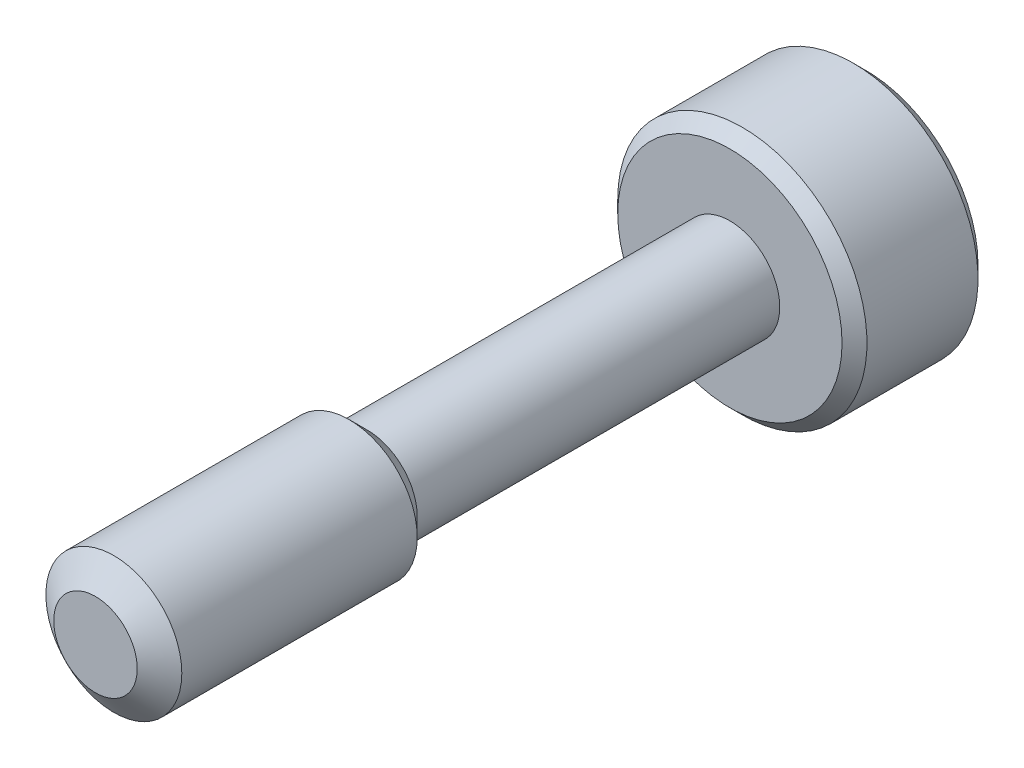
ISO-10303-21;
HEADER;
FILE_DESCRIPTION(('STEP AP214'),'2;1');
FILE_NAME('part.step','',(''),(''),'','','');
FILE_SCHEMA(('AUTOMOTIVE_DESIGN { 1 0 10303 214 1 1 1 1 }'));
ENDSEC;
DATA;
#1=APPLICATION_CONTEXT('core data for automotive mechanical design processes');
#2=APPLICATION_PROTOCOL_DEFINITION('international standard','automotive_design',2000,#1);
#3=PRODUCT_CONTEXT('',#1,'mechanical');
#4=PRODUCT('Part','Part','',(#3));
#5=PRODUCT_RELATED_PRODUCT_CATEGORY('part','',(#4));
#6=PRODUCT_DEFINITION_FORMATION('','',#4);
#7=PRODUCT_DEFINITION_CONTEXT('part definition',#1,'design');
#8=PRODUCT_DEFINITION('design','',#6,#7);
#9=PRODUCT_DEFINITION_SHAPE('','',#8);
#10=(LENGTH_UNIT() NAMED_UNIT(*) SI_UNIT(.MILLI.,.METRE.));
#11=(NAMED_UNIT(*) PLANE_ANGLE_UNIT() SI_UNIT($,.RADIAN.));
#12=(NAMED_UNIT(*) SI_UNIT($,.STERADIAN.) SOLID_ANGLE_UNIT());
#13=UNCERTAINTY_MEASURE_WITH_UNIT(LENGTH_MEASURE(1.E-05),#10,'distance_accuracy_value','');
#14=(GEOMETRIC_REPRESENTATION_CONTEXT(3) GLOBAL_UNCERTAINTY_ASSIGNED_CONTEXT((#13)) GLOBAL_UNIT_ASSIGNED_CONTEXT((#10,
#11,#12)) REPRESENTATION_CONTEXT('',''));
#15=CARTESIAN_POINT('',(0.,0.,0.));
#16=DIRECTION('',(0.,0.,1.));
#17=DIRECTION('',(1.,0.,0.));
#18=AXIS2_PLACEMENT_3D('',#15,#16,#17);
#19=CARTESIAN_POINT('',(0.,0.,-17.0000000000001));
#20=DIRECTION('',(0.,0.,1.));
#21=DIRECTION('',(1.,0.,0.));
#22=AXIS2_PLACEMENT_3D('',#19,#20,#21);
#23=CYLINDRICAL_SURFACE('',#22,2.75);
#24=CARTESIAN_POINT('',(0.,0.,-16.7250000000001));
#25=DIRECTION('',(0.,0.,-1.));
#26=DIRECTION('',(-1.,0.,0.));
#27=AXIS2_PLACEMENT_3D('',#24,#25,#26);
#28=CIRCLE('',#27,2.75);
#29=CARTESIAN_POINT('',(-2.75000000000008,0.,-16.7250000000001));
#30=VERTEX_POINT('',#29);
#31=EDGE_CURVE('E45',#30,#30,#28,.F.);
#32=ORIENTED_EDGE('',*,*,#31,.T.);
#33=EDGE_LOOP('',(#32));
#34=FACE_BOUND('',#33,.T.);
#35=CARTESIAN_POINT('',(0.,0.,-14.2750000000001));
#36=DIRECTION('',(0.,0.,-1.));
#37=DIRECTION('',(-1.,0.,0.));
#38=AXIS2_PLACEMENT_3D('',#35,#36,#37);
#39=CIRCLE('',#38,2.75);
#40=CARTESIAN_POINT('',(-2.75000000000001,0.,-14.2750000000001));
#41=VERTEX_POINT('',#40);
#42=EDGE_CURVE('E176',#41,#41,#39,.T.);
#43=ORIENTED_EDGE('',*,*,#42,.T.);
#44=EDGE_LOOP('',(#43));
#45=FACE_BOUND('',#44,.T.);
#46=ADVANCED_FACE('F37',(#34,#45),#23,.T.);
#47=CARTESIAN_POINT('',(0.,0.,-17.0000000000001));
#48=DIRECTION('',(0.,0.,-1.));
#49=DIRECTION('',(-1.,0.,0.));
#50=AXIS2_PLACEMENT_3D('',#47,#48,#49);
#51=PLANE('',#50);
#52=CARTESIAN_POINT('',(0.,0.,-17.0000000000001));
#53=DIRECTION('',(0.,0.,-1.));
#54=DIRECTION('',(-1.,0.,0.));
#55=AXIS2_PLACEMENT_3D('',#52,#53,#54);
#56=CIRCLE('',#55,2.47499999999999);
#57=CARTESIAN_POINT('',(-2.47500000000002,0.,-17.0000000000001));
#58=VERTEX_POINT('',#57);
#59=EDGE_CURVE('E110',#58,#58,#56,.T.);
#60=ORIENTED_EDGE('',*,*,#59,.T.);
#61=EDGE_LOOP('',(#60));
#62=FACE_BOUND('',#61,.T.);
#63=CARTESIAN_POINT('',(0.,0.,-17.0000000000001));
#64=DIRECTION('',(0.,0.,-1.));
#65=DIRECTION('',(-1.,0.,0.));
#66=AXIS2_PLACEMENT_3D('',#63,#64,#65);
#67=CIRCLE('',#66,1.44337567297407);
#68=CARTESIAN_POINT('',(-1.25,0.721687836487031,-17.0000000000001));
#69=VERTEX_POINT('',#68);
#70=CARTESIAN_POINT('',(0.,1.44337567297406,-17.0000000000001));
#71=VERTEX_POINT('',#70);
#72=EDGE_CURVE('E91',#69,#71,#67,.T.);
#73=ORIENTED_EDGE('',*,*,#72,.F.);
#74=CARTESIAN_POINT('',(-1.25000000000004,-0.721687836487041,-17.0000000000001));
#75=VERTEX_POINT('',#74);
#76=EDGE_CURVE('E51',#75,#69,#67,.T.);
#77=ORIENTED_EDGE('',*,*,#76,.F.);
#78=CARTESIAN_POINT('',(0.,-1.44337567297407,-17.0000000000001));
#79=VERTEX_POINT('',#78);
#80=EDGE_CURVE('E230',#79,#75,#67,.T.);
#81=ORIENTED_EDGE('',*,*,#80,.F.);
#82=CARTESIAN_POINT('',(1.25,-0.721687836487038,-17.0000000000001));
#83=VERTEX_POINT('',#82);
#84=EDGE_CURVE('E58',#83,#79,#67,.T.);
#85=ORIENTED_EDGE('',*,*,#84,.F.);
#86=CARTESIAN_POINT('',(1.24999999999997,0.721687836487043,-17.0000000000001));
#87=VERTEX_POINT('',#86);
#88=EDGE_CURVE('E131',#87,#83,#67,.T.);
#89=ORIENTED_EDGE('',*,*,#88,.F.);
#90=EDGE_CURVE('E100',#71,#87,#67,.T.);
#91=ORIENTED_EDGE('',*,*,#90,.F.);
#92=EDGE_LOOP('',(#73,#77,#81,#85,#89,#91));
#93=FACE_BOUND('',#92,.T.);
#94=ADVANCED_FACE('F130',(#62,#93),#51,.T.);
#95=CARTESIAN_POINT('',(0.,0.,-14.0000000000001));
#96=DIRECTION('',(0.,0.,-1.));
#97=DIRECTION('',(-1.,0.,0.));
#98=AXIS2_PLACEMENT_3D('',#95,#96,#97);
#99=PLANE('',#98);
#100=CARTESIAN_POINT('',(0.,0.,-14.0000000000001));
#101=DIRECTION('',(0.,0.,-1.));
#102=DIRECTION('',(-1.,0.,0.));
#103=AXIS2_PLACEMENT_3D('',#100,#101,#102);
#104=CIRCLE('',#103,2.47499999999999);
#105=CARTESIAN_POINT('',(-2.47500000000004,0.,-14.0000000000001));
#106=VERTEX_POINT('',#105);
#107=EDGE_CURVE('E12',#106,#106,#104,.F.);
#108=ORIENTED_EDGE('',*,*,#107,.T.);
#109=EDGE_LOOP('',(#108));
#110=FACE_BOUND('',#109,.T.);
#111=CARTESIAN_POINT('',(0.,0.,-14.0000000000001));
#112=DIRECTION('',(0.,0.,1.));
#113=DIRECTION('',(1.,0.,0.));
#114=AXIS2_PLACEMENT_3D('',#111,#112,#113);
#115=CIRCLE('',#114,1.1);
#116=CARTESIAN_POINT('',(1.09999999999996,0.,-14.0000000000001));
#117=VERTEX_POINT('',#116);
#118=EDGE_CURVE('E134',#117,#117,#115,.T.);
#119=ORIENTED_EDGE('',*,*,#118,.F.);
#120=EDGE_LOOP('',(#119));
#121=FACE_BOUND('',#120,.T.);
#122=ADVANCED_FACE('F189',(#110,#121),#99,.F.);
#123=CARTESIAN_POINT('',(0.,0.,-17.0000000000001));
#124=DIRECTION('',(0.,0.,-1.));
#125=DIRECTION('',(-1.,0.,0.));
#126=AXIS2_PLACEMENT_3D('',#123,#124,#125);
#127=CONICAL_SURFACE('',#126,1.44337567297407,0.78539816339745);
#128=ORIENTED_EDGE('',*,*,#90,.T.);
#129=CARTESIAN_POINT('',(-0.000200000000033507,1.44349114302788,-17.0001154839092));
#130=CARTESIAN_POINT('',(0.0427751670715469,1.41867941875062,-16.9753216680552));
#131=CARTESIAN_POINT('',(0.0864690047459079,1.3934527698074,-16.9519837344187));
#132=CARTESIAN_POINT('',(0.175565930841904,1.34201263554191,-16.9092520040846));
#133=CARTESIAN_POINT('',(0.220977498357029,1.31579425481273,-16.8898819923605));
#134=CARTESIAN_POINT('',(0.312547820935226,1.26292610442242,-16.8567004834135));
#135=CARTESIAN_POINT('',(0.35868324017585,1.23628980770467,-16.8428055590527));
#136=CARTESIAN_POINT('',(0.45197008040756,1.18243062538505,-16.8213972821607));
#137=CARTESIAN_POINT('',(0.499118649136354,1.15520938653759,-16.8138679415668));
#138=CARTESIAN_POINT('',(0.580373556887221,1.10829684367464,-16.8070744980508));
#139=CARTESIAN_POINT('',(0.614374876627901,1.08866617256955,-16.8060685591044));
#140=CARTESIAN_POINT('',(0.682317764432425,1.04943932800608,-16.8077614149114));
#141=CARTESIAN_POINT('',(0.716259317655601,1.02984316311597,-16.8104610272156));
#142=CARTESIAN_POINT('',(0.783814856457436,0.990839954603483,-16.8194089303164));
#143=CARTESIAN_POINT('',(0.817428507286709,0.971433104248758,-16.8256605258998));
#144=CARTESIAN_POINT('',(0.884094638217734,0.932943395609892,-16.841375681414));
#145=CARTESIAN_POINT('',(0.917146871030207,0.913860680098284,-16.8508406200875));
#146=CARTESIAN_POINT('',(1.00179969160018,0.864986351354538,-16.8789313906877));
#147=CARTESIAN_POINT('',(1.05286649242958,0.835502920149041,-16.8996701574523));
#148=CARTESIAN_POINT('',(1.15300085411324,0.777690319475875,-16.9463871346715));
#149=CARTESIAN_POINT('',(1.20207431157828,0.74935774559839,-16.9723482959468));
#150=CARTESIAN_POINT('',(1.25020000000003,0.721572366433179,-17.0001154839092));
#151=B_SPLINE_CURVE_WITH_KNOTS('',3,(#129,#130,#131,#132,#133,#134,#135,#136,#137,#138,#139,
#140,#141,#142,#143,#144,#145,#146,#147,#148,#149,#150),.UNSPECIFIED.,.F.,.F.,(4,2,2,2,2,2,2,2,
2,2,4),(0.,0.166533409618313,0.334037607289777,0.498880396489713,0.66330791924029,
0.780963963458827,0.898645970148436,1.0164376486077,1.13427993171545,1.32148652032142,
1.5080915879258),.UNSPECIFIED.);
#152=EDGE_CURVE('E105',#71,#87,#151,.T.);
#153=ORIENTED_EDGE('',*,*,#152,.F.);
#154=EDGE_LOOP('',(#128,#153));
#155=FACE_BOUND('',#154,.T.);
#156=ADVANCED_FACE('F106',(#155),#127,.F.);
#157=ORIENTED_EDGE('',*,*,#88,.T.);
#158=CARTESIAN_POINT('',(1.24999999999996,-1.43934010808079,-17.4629820968924));
#159=CARTESIAN_POINT('',(1.24999999999995,-1.4042931300566,-17.436524922633));
#160=CARTESIAN_POINT('',(1.24999999999995,-1.369050871356,-17.4103271603543));
#161=CARTESIAN_POINT('',(1.24999999999994,-1.29809650706312,-17.3585575718396));
#162=CARTESIAN_POINT('',(1.24999999999994,-1.26238428576496,-17.3329859043564));
#163=CARTESIAN_POINT('',(1.24999999999995,-1.15390111792709,-17.2570059936895));
#164=CARTESIAN_POINT('',(1.24999999999995,-1.08031646726265,-17.2077402861896));
#165=CARTESIAN_POINT('',(1.24999999999994,-0.926012322755103,-17.1110258302632));
#166=CARTESIAN_POINT('',(1.24999999999992,-0.845125318656155,-17.0638412989419));
#167=CARTESIAN_POINT('',(1.24999999999997,-0.679311174076612,-16.9775307343905));
#168=CARTESIAN_POINT('',(1.25000000000003,-0.594398891026699,-16.938377534627));
#169=CARTESIAN_POINT('',(1.24999999999999,-0.466944812460753,-16.8904772236884));
#170=CARTESIAN_POINT('',(1.24999999999996,-0.426289985812835,-16.8767294897864));
#171=CARTESIAN_POINT('',(1.24999999999993,-0.343998850091282,-16.8524979274506));
#172=CARTESIAN_POINT('',(1.24999999999994,-0.302362473614977,-16.8420143238698));
#173=CARTESIAN_POINT('',(1.24999999999995,-0.219052696285681,-16.8250301617484));
#174=CARTESIAN_POINT('',(1.24999999999996,-0.177393428474516,-16.8184613604714));
#175=CARTESIAN_POINT('',(1.24999999999993,-0.093629369340207,-16.8094350534578));
#176=CARTESIAN_POINT('',(1.2499999999999,-0.0515246558544098,-16.8069768409973));
#177=CARTESIAN_POINT('',(1.2499999999999,0.0311890576306193,-16.8063540620134));
#178=CARTESIAN_POINT('',(1.24999999999993,0.0717969625499186,-16.8080371168463));
#179=CARTESIAN_POINT('',(1.24999999999996,0.152668636885185,-16.815268270598));
#180=CARTESIAN_POINT('',(1.24999999999995,0.192932338835346,-16.8208171104132));
#181=CARTESIAN_POINT('',(1.24999999999994,0.273499879165281,-16.835571036465));
#182=CARTESIAN_POINT('',(1.24999999999994,0.313792180618496,-16.8448381759642));
#183=CARTESIAN_POINT('',(1.24999999999995,0.393496413911441,-16.8665361784574));
#184=CARTESIAN_POINT('',(1.24999999999997,0.432908419115043,-16.8789667767307));
#185=CARTESIAN_POINT('',(1.24999999999999,0.556992735862282,-16.9227793529315));
#186=CARTESIAN_POINT('',(1.24999999999996,0.639898924666068,-16.959151072876));
#187=CARTESIAN_POINT('',(1.24999999999993,0.801816555499681,-17.0400191621784));
#188=CARTESIAN_POINT('',(1.24999999999994,0.880812666325023,-17.084544720912));
#189=CARTESIAN_POINT('',(1.24999999999995,1.03178561279748,-17.1764048766667));
#190=CARTESIAN_POINT('',(1.24999999999995,1.10391618485084,-17.2234899339163));
#191=CARTESIAN_POINT('',(1.24999999999994,1.21018606043309,-17.2962785615986));
#192=CARTESIAN_POINT('',(1.24999999999994,1.24515069969378,-17.3207980853934));
#193=CARTESIAN_POINT('',(1.24999999999996,1.31460220852735,-17.3704856367657));
#194=CARTESIAN_POINT('',(1.24999999999998,1.34908920596617,-17.3956534854156));
#195=CARTESIAN_POINT('',(1.25000000000004,1.3833773168291,-17.4210901488413));
#196=B_SPLINE_CURVE_WITH_KNOTS('',3,(#158,#159,#160,#161,#162,#163,#164,#165,#166,#167,#168,
#169,#170,#171,#172,#173,#174,#175,#176,#177,#178,#179,#180,#181,#182,#183,#184,#185,#186,#187,
#188,#189,#190,#191,#192,#193,#194,#195),.UNSPECIFIED.,.F.,.F.,(4,2,2,2,2,2,2,2,2,2,2,2,2,2,2,2,
2,2,4),(0.,0.131732960381452,0.263498984161654,0.529042014455836,0.809741926134626,
1.08947609717226,1.21811634272577,1.34676544783901,1.47310084517844,1.59941451973785,
1.7211504216785,1.84290966131735,1.96679153905342,2.09066305366039,2.36146692896009,
2.6332598919849,2.89154668212279,3.01965734507713,3.14773302245629),.UNSPECIFIED.);
#197=EDGE_CURVE('E99',#87,#83,#196,.F.);
#198=ORIENTED_EDGE('',*,*,#197,.F.);
#199=EDGE_LOOP('',(#157,#198));
#200=FACE_BOUND('',#199,.T.);
#201=ADVANCED_FACE('F331',(#200),#127,.F.);
#202=ORIENTED_EDGE('',*,*,#84,.T.);
#203=CARTESIAN_POINT('',(1.25019999999999,-0.721572366433207,-17.0001154839092));
#204=CARTESIAN_POINT('',(1.20722483292839,-0.746384090710436,-16.9753216680552));
#205=CARTESIAN_POINT('',(1.16353099525401,-0.771610739653649,-16.9519837344187));
#206=CARTESIAN_POINT('',(1.07443406915801,-0.823050873919135,-16.9092520040846));
#207=CARTESIAN_POINT('',(1.02902250164288,-0.849269254648318,-16.8898819923605));
#208=CARTESIAN_POINT('',(0.937452179064682,-0.902137405038628,-16.8567004834135));
#209=CARTESIAN_POINT('',(0.891316759824051,-0.928773701756383,-16.8428055590527));
#210=CARTESIAN_POINT('',(0.798029919592327,-0.982632884076013,-16.8213972821607));
#211=CARTESIAN_POINT('',(0.75088135086353,-1.00985412292348,-16.8138679415669));
#212=CARTESIAN_POINT('',(0.669626443112651,-1.05676666578643,-16.8070744980508));
#213=CARTESIAN_POINT('',(0.635625123371965,-1.07639733689153,-16.8060685591044));
#214=CARTESIAN_POINT('',(0.567682235567431,-1.115624181455,-16.8077614149114));
#215=CARTESIAN_POINT('',(0.533740682344252,-1.13522034634511,-16.8104610272156));
#216=CARTESIAN_POINT('',(0.466185143542411,-1.1742235548576,-16.8194089303164));
#217=CARTESIAN_POINT('',(0.432571492713135,-1.19363040521233,-16.8256605258998));
#218=CARTESIAN_POINT('',(0.365905361782105,-1.2321201138512,-16.841375681414));
#219=CARTESIAN_POINT('',(0.332853128969631,-1.25120282936281,-16.8508406200875));
#220=CARTESIAN_POINT('',(0.248200308399679,-1.30007715810655,-16.8789313906877));
#221=CARTESIAN_POINT('',(0.197133507570306,-1.32956058931202,-16.8996701574523));
#222=CARTESIAN_POINT('',(0.0969991458867067,-1.38737318998516,-16.9463871346715));
#223=CARTESIAN_POINT('',(0.047925688421708,-1.41570576386265,-16.9723482959468));
#224=CARTESIAN_POINT('',(-0.000199999999977996,-1.4434911430279,-17.0001154839092));
#225=B_SPLINE_CURVE_WITH_KNOTS('',3,(#203,#204,#205,#206,#207,#208,#209,#210,#211,#212,#213,
#214,#215,#216,#217,#218,#219,#220,#221,#222,#223,#224),.UNSPECIFIED.,.F.,.F.,(4,2,2,2,2,2,2,2,
2,2,4),(0.,0.166533409618319,0.334037607289788,0.498880396489745,0.663307919240345,
0.780963963458896,0.89864597014852,1.0164376486078,1.13427993171555,1.32148652032142,
1.50809158792571),.UNSPECIFIED.);
#226=EDGE_CURVE('E144',#83,#79,#225,.T.);
#227=ORIENTED_EDGE('',*,*,#226,.F.);
#228=EDGE_LOOP('',(#202,#227));
#229=FACE_BOUND('',#228,.T.);
#230=ADVANCED_FACE('F325',(#229),#127,.F.);
#231=ORIENTED_EDGE('',*,*,#80,.T.);
#232=CARTESIAN_POINT('',(0.000200000000033507,-1.4434911430279,-17.0001154839092));
#233=CARTESIAN_POINT('',(-0.0427751670715866,-1.41867941875068,-16.9753216680552));
#234=CARTESIAN_POINT('',(-0.0864690047459589,-1.39345276980748,-16.9519837344188));
#235=CARTESIAN_POINT('',(-0.175565930841963,-1.34201263554199,-16.9092520040847));
#236=CARTESIAN_POINT('',(-0.220977498357084,-1.31579425481281,-16.8898819923605));
#237=CARTESIAN_POINT('',(-0.312547820935288,-1.2629261044225,-16.8567004834136));
#238=CARTESIAN_POINT('',(-0.358683240175922,-1.23628980770475,-16.8428055590528));
#239=CARTESIAN_POINT('',(-0.451970080407622,-1.18243062538511,-16.8213972821607));
#240=CARTESIAN_POINT('',(-0.499118649136393,-1.15520938653762,-16.8138679415668));
#241=CARTESIAN_POINT('',(-0.580373556887271,-1.10829684367468,-16.8070744980508));
#242=CARTESIAN_POINT('',(-0.614374876627972,-1.08866617256961,-16.8060685591044));
#243=CARTESIAN_POINT('',(-0.682317764432523,-1.04943932800615,-16.8077614149114));
#244=CARTESIAN_POINT('',(-0.716259317655705,-1.02984316311602,-16.8104610272156));
#245=CARTESIAN_POINT('',(-0.783814856457551,-0.990839954603522,-16.8194089303165));
#246=CARTESIAN_POINT('',(-0.817428507286827,-0.971433104248792,-16.8256605258998));
#247=CARTESIAN_POINT('',(-0.88409463821788,-0.932943395609926,-16.841375681414));
#248=CARTESIAN_POINT('',(-0.917146871030376,-0.913860680098323,-16.8508406200875));
#249=CARTESIAN_POINT('',(-1.00179969160034,-0.864986351354602,-16.8789313906876));
#250=CARTESIAN_POINT('',(-1.05286649242969,-0.835502920149116,-16.8996701574523));
#251=CARTESIAN_POINT('',(-1.15300085411326,-0.777690319475945,-16.9463871346716));
#252=CARTESIAN_POINT('',(-1.20207431157825,-0.749357745598441,-16.9723482959469));
#253=CARTESIAN_POINT('',(-1.25019999999998,-0.721572366433195,-17.0001154839092));
#254=B_SPLINE_CURVE_WITH_KNOTS('',3,(#232,#233,#234,#235,#236,#237,#238,#239,#240,#241,#242,
#243,#244,#245,#246,#247,#248,#249,#250,#251,#252,#253),.UNSPECIFIED.,.F.,.F.,(4,2,2,2,2,2,2,2,
2,2,4),(0.,0.166533409618298,0.334037607289772,0.498880396489719,0.663307919240297,
0.780963963458857,0.898645970148498,1.01643764860779,1.13427993171556,1.32148652032143,
1.50809158792572),.UNSPECIFIED.);
#255=EDGE_CURVE('E236',#79,#75,#254,.T.);
#256=ORIENTED_EDGE('',*,*,#255,.F.);
#257=EDGE_LOOP('',(#231,#256));
#258=FACE_BOUND('',#257,.T.);
#259=ADVANCED_FACE('F234',(#258),#127,.F.);
#260=ORIENTED_EDGE('',*,*,#76,.T.);
#261=CARTESIAN_POINT('',(-1.24999999999995,-1.43934010808078,-17.4629820968924));
#262=CARTESIAN_POINT('',(-1.25000000000001,-1.40429313005659,-17.436524922633));
#263=CARTESIAN_POINT('',(-1.25000000000003,-1.36905087135599,-17.4103271603544));
#264=CARTESIAN_POINT('',(-1.25000000000005,-1.2980965070631,-17.3585575718397));
#265=CARTESIAN_POINT('',(-1.25000000000005,-1.26238428576495,-17.3329859043564));
#266=CARTESIAN_POINT('',(-1.25000000000003,-1.15390111792708,-17.2570059936895));
#267=CARTESIAN_POINT('',(-1.25000000000003,-1.08031646726264,-17.2077402861896));
#268=CARTESIAN_POINT('',(-1.25000000000005,-0.92601232275508,-17.1110258302632));
#269=CARTESIAN_POINT('',(-1.25000000000008,-0.845125318656126,-17.0638412989419));
#270=CARTESIAN_POINT('',(-1.25000000000001,-0.679311174076594,-16.9775307343905));
#271=CARTESIAN_POINT('',(-1.24999999999992,-0.594398891026696,-16.9383775346269));
#272=CARTESIAN_POINT('',(-1.24999999999998,-0.466944812460747,-16.8904772236884));
#273=CARTESIAN_POINT('',(-1.25000000000002,-0.426289985812825,-16.8767294897864));
#274=CARTESIAN_POINT('',(-1.25000000000006,-0.343998850091271,-16.8524979274506));
#275=CARTESIAN_POINT('',(-1.25000000000005,-0.302362473614969,-16.8420143238699));
#276=CARTESIAN_POINT('',(-1.25000000000004,-0.219052696285677,-16.8250301617484));
#277=CARTESIAN_POINT('',(-1.25000000000003,-0.177393428474512,-16.8184613604715));
#278=CARTESIAN_POINT('',(-1.25000000000005,-0.0936293693402089,-16.8094350534579));
#279=CARTESIAN_POINT('',(-1.25000000000007,-0.0515246558544161,-16.8069768409973));
#280=CARTESIAN_POINT('',(-1.25000000000007,0.0311890576306077,-16.8063540620134));
#281=CARTESIAN_POINT('',(-1.25000000000005,0.0717969625499061,-16.8080371168463));
#282=CARTESIAN_POINT('',(-1.25000000000003,0.152668636885174,-16.815268270598));
#283=CARTESIAN_POINT('',(-1.25000000000004,0.192932338835336,-16.8208171104132));
#284=CARTESIAN_POINT('',(-1.25000000000005,0.273499879165273,-16.8355710364651));
#285=CARTESIAN_POINT('',(-1.25000000000006,0.313792180618488,-16.8448381759642));
#286=CARTESIAN_POINT('',(-1.25000000000002,0.393496413911439,-16.8665361784574));
#287=CARTESIAN_POINT('',(-1.24999999999998,0.432908419115047,-16.8789667767307));
#288=CARTESIAN_POINT('',(-1.24999999999992,0.556992735862289,-16.9227793529315));
#289=CARTESIAN_POINT('',(-1.25000000000001,0.639898924666055,-16.959151072876));
#290=CARTESIAN_POINT('',(-1.25000000000008,0.801816555499653,-17.0400191621784));
#291=CARTESIAN_POINT('',(-1.25000000000005,0.880812666324999,-17.0845447209121));
#292=CARTESIAN_POINT('',(-1.25000000000003,1.03178561279746,-17.1764048766667));
#293=CARTESIAN_POINT('',(-1.25000000000004,1.10391618485082,-17.2234899339163));
#294=CARTESIAN_POINT('',(-1.25000000000004,1.21018606043307,-17.2962785615986));
#295=CARTESIAN_POINT('',(-1.25000000000004,1.24515069969376,-17.3207980853934));
#296=CARTESIAN_POINT('',(-1.25000000000004,1.31460220852733,-17.3704856367657));
#297=CARTESIAN_POINT('',(-1.25000000000004,1.34908920596615,-17.3956534854156));
#298=CARTESIAN_POINT('',(-1.25000000000003,1.38337731682909,-17.4210901488413));
#299=B_SPLINE_CURVE_WITH_KNOTS('',3,(#261,#262,#263,#264,#265,#266,#267,#268,#269,#270,#271,
#272,#273,#274,#275,#276,#277,#278,#279,#280,#281,#282,#283,#284,#285,#286,#287,#288,#289,#290,
#291,#292,#293,#294,#295,#296,#297,#298),.UNSPECIFIED.,.F.,.F.,(4,2,2,2,2,2,2,2,2,2,2,2,2,2,2,2,
2,2,4),(0.,0.131732960381446,0.263498984161643,0.529042014455836,0.809741926134628,
1.08947609717225,1.21811634272575,1.34676544783899,1.47310084517842,1.59941451973782,
1.72115042167847,1.84290966131732,1.96679153905339,2.09066305366036,2.36146692896005,
2.63325989198486,2.89154668212275,3.01965734507708,3.14773302245623),.UNSPECIFIED.);
#300=EDGE_CURVE('E120',#75,#69,#299,.T.);
#301=ORIENTED_EDGE('',*,*,#300,.F.);
#302=EDGE_LOOP('',(#260,#301));
#303=FACE_BOUND('',#302,.T.);
#304=ADVANCED_FACE('F313',(#303),#127,.F.);
#305=ORIENTED_EDGE('',*,*,#72,.T.);
#306=CARTESIAN_POINT('',(-1.25020000000001,0.72157236643319,-17.0001154839092));
#307=CARTESIAN_POINT('',(-1.20722483292843,0.74638409071044,-16.9753216680552));
#308=CARTESIAN_POINT('',(-1.16353099525407,0.77161073965366,-16.9519837344188));
#309=CARTESIAN_POINT('',(-1.07443406915809,0.823050873919148,-16.9092520040846));
#310=CARTESIAN_POINT('',(-1.02902250164297,0.849269254648325,-16.8898819923605));
#311=CARTESIAN_POINT('',(-0.937452179064775,0.902137405038622,-16.8567004834136));
#312=CARTESIAN_POINT('',(-0.891316759824153,0.92877370175637,-16.8428055590528));
#313=CARTESIAN_POINT('',(-0.79802991959246,0.982632884075993,-16.8213972821607));
#314=CARTESIAN_POINT('',(-0.750881350863684,1.00985412292346,-16.8138679415668));
#315=CARTESIAN_POINT('',(-0.669626443112817,1.0567666657864,-16.8070744980508));
#316=CARTESIAN_POINT('',(-0.635625123372126,1.07639733689149,-16.8060685591044));
#317=CARTESIAN_POINT('',(-0.567682235567587,1.11562418145496,-16.8077614149114));
#318=CARTESIAN_POINT('',(-0.533740682344408,1.13522034634507,-16.8104610272156));
#319=CARTESIAN_POINT('',(-0.466185143542564,1.17422355485757,-16.8194089303165));
#320=CARTESIAN_POINT('',(-0.432571492713287,1.19363040521229,-16.8256605258998));
#321=CARTESIAN_POINT('',(-0.36590536178225,1.23212011385117,-16.841375681414));
#322=CARTESIAN_POINT('',(-0.332853128969771,1.25120282936278,-16.8508406200875));
#323=CARTESIAN_POINT('',(-0.248200308399797,1.30007715810653,-16.8789313906877));
#324=CARTESIAN_POINT('',(-0.197133507570411,1.32956058931202,-16.8996701574523));
#325=CARTESIAN_POINT('',(-0.0969991458867663,1.38737318998517,-16.9463871346716));
#326=CARTESIAN_POINT('',(-0.0479256884217366,1.41570576386265,-16.9723482959469));
#327=CARTESIAN_POINT('',(0.000200000000005751,1.44349114302789,-17.0001154839092));
#328=B_SPLINE_CURVE_WITH_KNOTS('',3,(#306,#307,#308,#309,#310,#311,#312,#313,#314,#315,#316,
#317,#318,#319,#320,#321,#322,#323,#324,#325,#326,#327),.UNSPECIFIED.,.F.,.F.,(4,2,2,2,2,2,2,2,
2,2,4),(0.,0.166533409618286,0.334037607289736,0.498880396489657,0.663307919240213,
0.780963963458764,0.898645970148392,1.01643764860767,1.13427993171544,1.32148652032138,
1.50809158792574),.UNSPECIFIED.);
#329=EDGE_CURVE('E95',#69,#71,#328,.T.);
#330=ORIENTED_EDGE('',*,*,#329,.F.);
#331=EDGE_LOOP('',(#305,#330));
#332=FACE_BOUND('',#331,.T.);
#333=ADVANCED_FACE('F93',(#332),#127,.F.);
#334=CARTESIAN_POINT('',(-2.5,0.,-15.1250000000001));
#335=DIRECTION('',(0.,0.,1.));
#336=DIRECTION('',(1.,0.,0.));
#337=AXIS2_PLACEMENT_3D('',#334,#335,#336);
#338=PLANE('',#337);
#339=DIRECTION('',(0.866025403784438,0.499999999999999,0.));
#340=VECTOR('',#339,1.);
#341=CARTESIAN_POINT('',(-1.25000000000002,0.721687836487031,-15.1250000000001));
#342=LINE('',#341,#340);
#343=CARTESIAN_POINT('',(-1.25000000000002,0.721687836487031,-15.1250000000001));
#344=VERTEX_POINT('',#343);
#345=CARTESIAN_POINT('',(0.,1.44337567297406,-15.1250000000001));
#346=VERTEX_POINT('',#345);
#347=EDGE_CURVE('E119',#344,#346,#342,.T.);
#348=ORIENTED_EDGE('',*,*,#347,.T.);
#349=DIRECTION('',(0.866025403784438,-0.499999999999999,0.));
#350=VECTOR('',#349,1.);
#351=CARTESIAN_POINT('',(0.,1.44337567297406,-15.1250000000001));
#352=LINE('',#351,#350);
#353=CARTESIAN_POINT('',(1.24999999999995,0.721687836487034,-15.1250000000001));
#354=VERTEX_POINT('',#353);
#355=EDGE_CURVE('E124',#346,#354,#352,.T.);
#356=ORIENTED_EDGE('',*,*,#355,.T.);
#357=DIRECTION('',(0.,-1.,0.));
#358=VECTOR('',#357,1.);
#359=CARTESIAN_POINT('',(1.24999999999995,0.721687836487034,-15.1250000000001));
#360=LINE('',#359,#358);
#361=CARTESIAN_POINT('',(1.24999999999993,-0.721687836487029,-15.1250000000001));
#362=VERTEX_POINT('',#361);
#363=EDGE_CURVE('E257',#354,#362,#360,.T.);
#364=ORIENTED_EDGE('',*,*,#363,.T.);
#365=DIRECTION('',(-0.866025403784437,-0.5,0.));
#366=VECTOR('',#365,1.);
#367=CARTESIAN_POINT('',(1.24999999999993,-0.721687836487029,-15.1250000000001));
#368=LINE('',#367,#366);
#369=CARTESIAN_POINT('',(0.,-1.44337567297407,-15.1250000000001));
#370=VERTEX_POINT('',#369);
#371=EDGE_CURVE('E259',#362,#370,#368,.T.);
#372=ORIENTED_EDGE('',*,*,#371,.T.);
#373=DIRECTION('',(-0.866025403784437,0.5,0.));
#374=VECTOR('',#373,1.);
#375=CARTESIAN_POINT('',(0.,-1.44337567297407,-15.1250000000001));
#376=LINE('',#375,#374);
#377=CARTESIAN_POINT('',(-1.25000000000004,-0.721687836487041,-15.1250000000001));
#378=VERTEX_POINT('',#377);
#379=EDGE_CURVE('E248',#370,#378,#376,.T.);
#380=ORIENTED_EDGE('',*,*,#379,.T.);
#381=DIRECTION('',(0.,0.999999999999999,0.));
#382=VECTOR('',#381,1.);
#383=CARTESIAN_POINT('',(-1.25000000000004,-0.721687836487041,-15.1250000000001));
#384=LINE('',#383,#382);
#385=EDGE_CURVE('E127',#378,#344,#384,.T.);
#386=ORIENTED_EDGE('',*,*,#385,.T.);
#387=EDGE_LOOP('',(#348,#356,#364,#372,#380,#386));
#388=FACE_BOUND('',#387,.T.);
#389=ADVANCED_FACE('F165',(#388),#338,.F.);
#390=CARTESIAN_POINT('',(0.,1.44337567297406,-15.1250000000001));
#391=DIRECTION('',(0.499999999999999,0.866025403784438,0.));
#392=DIRECTION('',(-0.866025403784438,0.499999999999999,0.));
#393=AXIS2_PLACEMENT_3D('',#390,#391,#392);
#394=PLANE('',#393);
#395=DIRECTION('',(0.,0.,-1.));
#396=VECTOR('',#395,1.);
#397=CARTESIAN_POINT('',(0.,1.44337567297406,-15.1250000000001));
#398=LINE('',#397,#396);
#399=EDGE_CURVE('E117',#346,#71,#398,.T.);
#400=ORIENTED_EDGE('',*,*,#399,.T.);
#401=ORIENTED_EDGE('',*,*,#152,.T.);
#402=DIRECTION('',(0.,0.,-1.));
#403=VECTOR('',#402,1.);
#404=CARTESIAN_POINT('',(1.24999999999995,0.721687836487034,-15.1250000000001));
#405=LINE('',#404,#403);
#406=EDGE_CURVE('E126',#354,#87,#405,.T.);
#407=ORIENTED_EDGE('',*,*,#406,.F.);
#408=ORIENTED_EDGE('',*,*,#355,.F.);
#409=EDGE_LOOP('',(#400,#401,#407,#408));
#410=FACE_BOUND('',#409,.T.);
#411=ADVANCED_FACE('F122',(#410),#394,.F.);
#412=CARTESIAN_POINT('',(1.24999999999995,0.721687836487034,-15.1250000000001));
#413=DIRECTION('',(1.,0.,0.));
#414=DIRECTION('',(0.,1.,0.));
#415=AXIS2_PLACEMENT_3D('',#412,#413,#414);
#416=PLANE('',#415);
#417=ORIENTED_EDGE('',*,*,#406,.T.);
#418=ORIENTED_EDGE('',*,*,#197,.T.);
#419=DIRECTION('',(0.,0.,-1.));
#420=VECTOR('',#419,1.);
#421=CARTESIAN_POINT('',(1.24999999999993,-0.721687836487029,-15.1250000000001));
#422=LINE('',#421,#420);
#423=EDGE_CURVE('E245',#362,#83,#422,.T.);
#424=ORIENTED_EDGE('',*,*,#423,.F.);
#425=ORIENTED_EDGE('',*,*,#363,.F.);
#426=EDGE_LOOP('',(#417,#418,#424,#425));
#427=FACE_BOUND('',#426,.T.);
#428=ADVANCED_FACE('F154',(#427),#416,.F.);
#429=CARTESIAN_POINT('',(1.24999999999993,-0.721687836487029,-15.1250000000001));
#430=DIRECTION('',(0.5,-0.866025403784437,0.));
#431=DIRECTION('',(0.866025403784438,0.5,0.));
#432=AXIS2_PLACEMENT_3D('',#429,#430,#431);
#433=PLANE('',#432);
#434=ORIENTED_EDGE('',*,*,#423,.T.);
#435=ORIENTED_EDGE('',*,*,#226,.T.);
#436=DIRECTION('',(0.,0.,-1.));
#437=VECTOR('',#436,1.);
#438=CARTESIAN_POINT('',(0.,-1.44337567297407,-15.1250000000001));
#439=LINE('',#438,#437);
#440=EDGE_CURVE('E243',#370,#79,#439,.T.);
#441=ORIENTED_EDGE('',*,*,#440,.F.);
#442=ORIENTED_EDGE('',*,*,#371,.F.);
#443=EDGE_LOOP('',(#434,#435,#441,#442));
#444=FACE_BOUND('',#443,.T.);
#445=ADVANCED_FACE('F158',(#444),#433,.F.);
#446=CARTESIAN_POINT('',(0.,-1.44337567297407,-15.1250000000001));
#447=DIRECTION('',(-0.5,-0.866025403784437,0.));
#448=DIRECTION('',(0.866025403784437,-0.5,0.));
#449=AXIS2_PLACEMENT_3D('',#446,#447,#448);
#450=PLANE('',#449);
#451=ORIENTED_EDGE('',*,*,#440,.T.);
#452=ORIENTED_EDGE('',*,*,#255,.T.);
#453=DIRECTION('',(0.,0.,-1.));
#454=VECTOR('',#453,1.);
#455=CARTESIAN_POINT('',(-1.25000000000004,-0.721687836487041,-15.1250000000001));
#456=LINE('',#455,#454);
#457=EDGE_CURVE('E250',#378,#75,#456,.T.);
#458=ORIENTED_EDGE('',*,*,#457,.F.);
#459=ORIENTED_EDGE('',*,*,#379,.F.);
#460=EDGE_LOOP('',(#451,#452,#458,#459));
#461=FACE_BOUND('',#460,.T.);
#462=ADVANCED_FACE('F246',(#461),#450,.F.);
#463=CARTESIAN_POINT('',(-1.25000000000004,-0.721687836487041,-15.1250000000001));
#464=DIRECTION('',(-0.999999999999999,0.,0.));
#465=DIRECTION('',(0.,-0.999999999999999,0.));
#466=AXIS2_PLACEMENT_3D('',#463,#464,#465);
#467=PLANE('',#466);
#468=ORIENTED_EDGE('',*,*,#457,.T.);
#469=ORIENTED_EDGE('',*,*,#300,.T.);
#470=DIRECTION('',(0.,0.,-1.));
#471=VECTOR('',#470,1.);
#472=CARTESIAN_POINT('',(-1.25000000000002,0.721687836487031,-15.1250000000001));
#473=LINE('',#472,#471);
#474=EDGE_CURVE('E111',#344,#69,#473,.T.);
#475=ORIENTED_EDGE('',*,*,#474,.F.);
#476=ORIENTED_EDGE('',*,*,#385,.F.);
#477=EDGE_LOOP('',(#468,#469,#475,#476));
#478=FACE_BOUND('',#477,.T.);
#479=ADVANCED_FACE('F269',(#478),#467,.F.);
#480=CARTESIAN_POINT('',(-1.25000000000002,0.721687836487031,-15.1250000000001));
#481=DIRECTION('',(-0.499999999999999,0.866025403784438,0.));
#482=DIRECTION('',(-0.866025403784438,-0.499999999999999,0.));
#483=AXIS2_PLACEMENT_3D('',#480,#481,#482);
#484=PLANE('',#483);
#485=ORIENTED_EDGE('',*,*,#474,.T.);
#486=ORIENTED_EDGE('',*,*,#329,.T.);
#487=ORIENTED_EDGE('',*,*,#399,.F.);
#488=ORIENTED_EDGE('',*,*,#347,.F.);
#489=EDGE_LOOP('',(#485,#486,#487,#488));
#490=FACE_BOUND('',#489,.T.);
#491=ADVANCED_FACE('F115',(#490),#484,.F.);
#492=CARTESIAN_POINT('',(0.,0.,-17.0000000000001));
#493=DIRECTION('',(0.,0.,1.));
#494=DIRECTION('',(1.,0.,0.));
#495=AXIS2_PLACEMENT_3D('',#492,#493,#494);
#496=CONICAL_SURFACE('',#495,2.47499999999999,0.785398163397448);
#497=ORIENTED_EDGE('',*,*,#31,.F.);
#498=EDGE_LOOP('',(#497));
#499=FACE_BOUND('',#498,.T.);
#500=ORIENTED_EDGE('',*,*,#59,.F.);
#501=EDGE_LOOP('',(#500));
#502=FACE_BOUND('',#501,.T.);
#503=ADVANCED_FACE('F183',(#499,#502),#496,.T.);
#504=CARTESIAN_POINT('',(0.,0.,-14.2750000000001));
#505=DIRECTION('',(0.,0.,-1.));
#506=DIRECTION('',(-1.,0.,0.));
#507=AXIS2_PLACEMENT_3D('',#504,#505,#506);
#508=CONICAL_SURFACE('',#507,2.75,0.785398163397458);
#509=ORIENTED_EDGE('',*,*,#107,.F.);
#510=EDGE_LOOP('',(#509));
#511=FACE_BOUND('',#510,.T.);
#512=ORIENTED_EDGE('',*,*,#42,.F.);
#513=EDGE_LOOP('',(#512));
#514=FACE_BOUND('',#513,.T.);
#515=ADVANCED_FACE('F39',(#511,#514),#508,.T.);
#516=CARTESIAN_POINT('',(0.,0.,-6.00000000000003));
#517=DIRECTION('',(0.,0.,-1.));
#518=DIRECTION('',(-1.,0.,0.));
#519=AXIS2_PLACEMENT_3D('',#516,#517,#518);
#520=CYLINDRICAL_SURFACE('',#519,1.1);
#521=CARTESIAN_POINT('',(0.,0.,-6.00000000000003));
#522=DIRECTION('',(0.,0.,1.));
#523=DIRECTION('',(1.,0.,0.));
#524=AXIS2_PLACEMENT_3D('',#521,#522,#523);
#525=CIRCLE('',#524,1.1);
#526=CARTESIAN_POINT('',(1.1,0.,-6.00000000000003));
#527=VERTEX_POINT('',#526);
#528=EDGE_CURVE('E220',#527,#527,#525,.T.);
#529=ORIENTED_EDGE('',*,*,#528,.F.);
#530=EDGE_LOOP('',(#529));
#531=FACE_BOUND('',#530,.T.);
#532=ORIENTED_EDGE('',*,*,#118,.T.);
#533=EDGE_LOOP('',(#532));
#534=FACE_BOUND('',#533,.T.);
#535=ADVANCED_FACE('F356',(#531,#534),#520,.T.);
#536=CARTESIAN_POINT('',(0.,0.,-5.60000000000001));
#537=DIRECTION('',(0.,0.,1.));
#538=DIRECTION('',(1.,0.,0.));
#539=AXIS2_PLACEMENT_3D('',#536,#537,#538);
#540=CONICAL_SURFACE('',#539,1.5,0.785398163397447);
#541=ORIENTED_EDGE('',*,*,#528,.T.);
#542=EDGE_LOOP('',(#541));
#543=FACE_BOUND('',#542,.T.);
#544=CARTESIAN_POINT('',(0.,0.,-5.60000000000001));
#545=DIRECTION('',(0.,0.,1.));
#546=DIRECTION('',(1.,0.,0.));
#547=AXIS2_PLACEMENT_3D('',#544,#545,#546);
#548=CIRCLE('',#547,1.5);
#549=CARTESIAN_POINT('',(1.5,0.,-5.60000000000001));
#550=VERTEX_POINT('',#549);
#551=EDGE_CURVE('E218',#550,#550,#548,.T.);
#552=ORIENTED_EDGE('',*,*,#551,.F.);
#553=EDGE_LOOP('',(#552));
#554=FACE_BOUND('',#553,.T.);
#555=ADVANCED_FACE('F202',(#543,#554),#540,.T.);
#556=CARTESIAN_POINT('',(0.,0.,0.));
#557=DIRECTION('',(0.,0.,1.));
#558=DIRECTION('',(1.,0.,0.));
#559=AXIS2_PLACEMENT_3D('',#556,#557,#558);
#560=PLANE('',#559);
#561=CARTESIAN_POINT('',(0.,0.,0.));
#562=DIRECTION('',(0.,0.,1.));
#563=DIRECTION('',(1.,0.,0.));
#564=AXIS2_PLACEMENT_3D('',#561,#562,#563);
#565=CIRCLE('',#564,0.921240473580831);
#566=CARTESIAN_POINT('',(0.921240473580831,0.,0.));
#567=VERTEX_POINT('',#566);
#568=EDGE_CURVE('E223',#567,#567,#565,.T.);
#569=ORIENTED_EDGE('',*,*,#568,.T.);
#570=EDGE_LOOP('',(#569));
#571=FACE_BOUND('',#570,.T.);
#572=ADVANCED_FACE('F198',(#571),#560,.T.);
#573=CARTESIAN_POINT('',(0.,0.,0.));
#574=DIRECTION('',(0.,0.,-1.));
#575=DIRECTION('',(-1.,0.,0.));
#576=AXIS2_PLACEMENT_3D('',#573,#574,#575);
#577=CONICAL_SURFACE('',#576,0.921240473580831,0.959931088596884);
#578=CARTESIAN_POINT('',(0.,0.,-0.405251783209382));
#579=DIRECTION('',(0.,0.,1.));
#580=DIRECTION('',(1.,0.,0.));
#581=AXIS2_PLACEMENT_3D('',#578,#579,#580);
#582=CIRCLE('',#581,1.5);
#583=CARTESIAN_POINT('',(1.5,0.,-0.405251783209382));
#584=VERTEX_POINT('',#583);
#585=EDGE_CURVE('E215',#584,#584,#582,.T.);
#586=ORIENTED_EDGE('',*,*,#585,.T.);
#587=EDGE_LOOP('',(#586));
#588=FACE_BOUND('',#587,.T.);
#589=ORIENTED_EDGE('',*,*,#568,.F.);
#590=EDGE_LOOP('',(#589));
#591=FACE_BOUND('',#590,.T.);
#592=ADVANCED_FACE('F201',(#588,#591),#577,.T.);
#593=CARTESIAN_POINT('',(0.,0.,-14.0000000000001));
#594=DIRECTION('',(0.,0.,1.));
#595=DIRECTION('',(1.,0.,0.));
#596=AXIS2_PLACEMENT_3D('',#593,#594,#595);
#597=CYLINDRICAL_SURFACE('',#596,1.5);
#598=ORIENTED_EDGE('',*,*,#585,.F.);
#599=EDGE_LOOP('',(#598));
#600=FACE_BOUND('',#599,.T.);
#601=ORIENTED_EDGE('',*,*,#551,.T.);
#602=EDGE_LOOP('',(#601));
#603=FACE_BOUND('',#602,.T.);
#604=ADVANCED_FACE('F204',(#600,#603),#597,.T.);
#605=CLOSED_SHELL('',(#46,#94,#122,#156,#201,#230,#259,#304,#333,#389,#411,#428,#445,#462,#479,
#491,#503,#515,#535,#555,#572,#592,#604));
#606=MANIFOLD_SOLID_BREP('B2',#605);
#607=ADVANCED_BREP_SHAPE_REPRESENTATION('',(#18,#606),#14);
#608=SHAPE_DEFINITION_REPRESENTATION(#9,#607);
ENDSEC;
END-ISO-10303-21;
